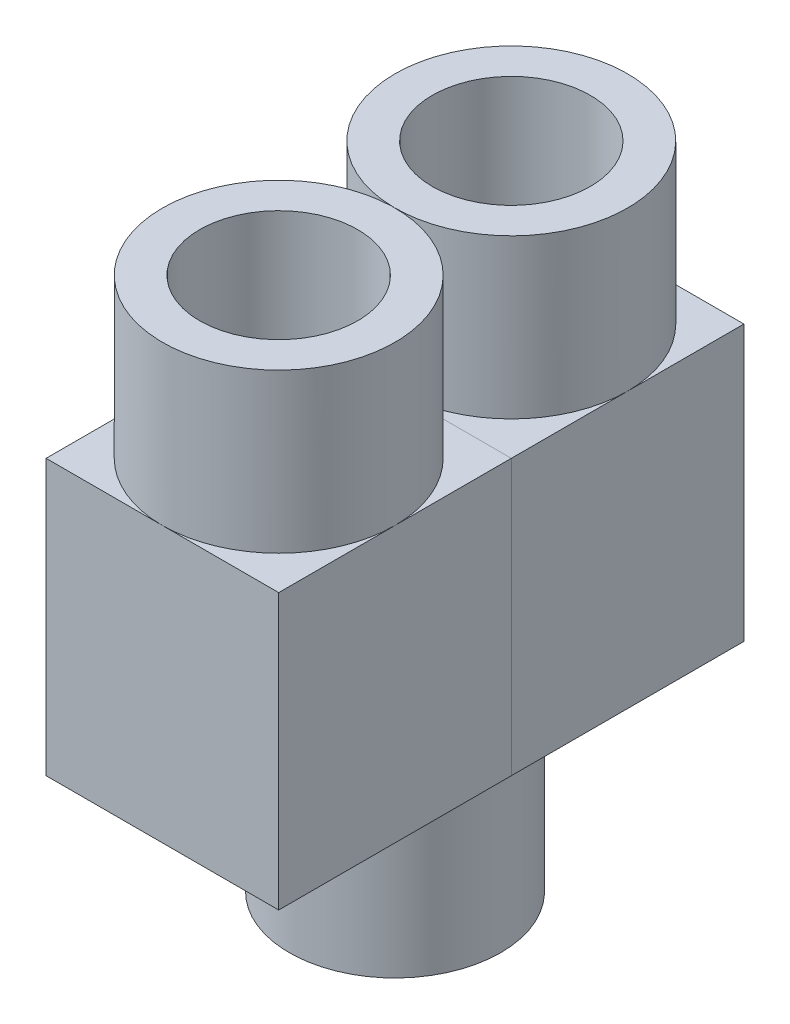
ISO-10303-21;
HEADER;
FILE_DESCRIPTION(('STEP AP214'),'2;1');
FILE_NAME('part.step','',(''),(''),'','','');
FILE_SCHEMA(('AUTOMOTIVE_DESIGN { 1 0 10303 214 1 1 1 1 }'));
ENDSEC;
DATA;
#1=APPLICATION_CONTEXT('core data for automotive mechanical design processes');
#2=APPLICATION_PROTOCOL_DEFINITION('international standard','automotive_design',2000,#1);
#3=PRODUCT_CONTEXT('',#1,'mechanical');
#4=PRODUCT('Part','Part','',(#3));
#5=PRODUCT_RELATED_PRODUCT_CATEGORY('part','',(#4));
#6=PRODUCT_DEFINITION_FORMATION('','',#4);
#7=PRODUCT_DEFINITION_CONTEXT('part definition',#1,'design');
#8=PRODUCT_DEFINITION('design','',#6,#7);
#9=PRODUCT_DEFINITION_SHAPE('','',#8);
#10=(LENGTH_UNIT() NAMED_UNIT(*) SI_UNIT(.MILLI.,.METRE.));
#11=(NAMED_UNIT(*) PLANE_ANGLE_UNIT() SI_UNIT($,.RADIAN.));
#12=(NAMED_UNIT(*) SI_UNIT($,.STERADIAN.) SOLID_ANGLE_UNIT());
#13=UNCERTAINTY_MEASURE_WITH_UNIT(LENGTH_MEASURE(1.E-05),#10,'distance_accuracy_value','');
#14=(GEOMETRIC_REPRESENTATION_CONTEXT(3) GLOBAL_UNCERTAINTY_ASSIGNED_CONTEXT((#13)) GLOBAL_UNIT_ASSIGNED_CONTEXT((#10,
#11,#12)) REPRESENTATION_CONTEXT('',''));
#15=CARTESIAN_POINT('',(0.,0.,0.));
#16=DIRECTION('',(0.,0.,1.));
#17=DIRECTION('',(1.,0.,0.));
#18=AXIS2_PLACEMENT_3D('',#15,#16,#17);
#19=CARTESIAN_POINT('',(0.,0.,11.));
#20=DIRECTION('',(0.,-1.,0.));
#21=DIRECTION('',(0.,0.,-1.));
#22=AXIS2_PLACEMENT_3D('',#19,#20,#21);
#23=PLANE('',#22);
#24=CARTESIAN_POINT('',(0.,0.,11.));
#25=DIRECTION('',(0.,-1.,0.));
#26=DIRECTION('',(1.,0.,0.));
#27=AXIS2_PLACEMENT_3D('',#24,#25,#26);
#28=CIRCLE('',#27,10.);
#29=CARTESIAN_POINT('',(10.,0.,11.));
#30=VERTEX_POINT('',#29);
#31=EDGE_CURVE('E12',#30,#30,#28,.T.);
#32=ORIENTED_EDGE('',*,*,#31,.T.);
#33=EDGE_LOOP('',(#32));
#34=FACE_BOUND('',#33,.T.);
#35=CARTESIAN_POINT('',(0.,0.,11.));
#36=DIRECTION('',(0.,-1.,0.));
#37=DIRECTION('',(0.,0.,-1.));
#38=AXIS2_PLACEMENT_3D('',#35,#36,#37);
#39=CIRCLE('',#38,8.);
#40=CARTESIAN_POINT('',(0.,0.,3.));
#41=VERTEX_POINT('',#40);
#42=EDGE_CURVE('E89',#41,#41,#39,.T.);
#43=ORIENTED_EDGE('',*,*,#42,.F.);
#44=EDGE_LOOP('',(#43));
#45=FACE_BOUND('',#44,.T.);
#46=ADVANCED_FACE('F78',(#34,#45),#23,.T.);
#47=CARTESIAN_POINT('',(0.,15.,11.));
#48=DIRECTION('',(0.,-1.,0.));
#49=DIRECTION('',(0.,0.,-1.));
#50=AXIS2_PLACEMENT_3D('',#47,#48,#49);
#51=PLANE('',#50);
#52=CARTESIAN_POINT('',(0.,15.,11.));
#53=DIRECTION('',(0.,-1.,0.));
#54=DIRECTION('',(1.,0.,0.));
#55=AXIS2_PLACEMENT_3D('',#52,#53,#54);
#56=CIRCLE('',#55,10.);
#57=CARTESIAN_POINT('',(10.,15.,11.));
#58=VERTEX_POINT('',#57);
#59=EDGE_CURVE('E82',#58,#58,#56,.T.);
#60=ORIENTED_EDGE('',*,*,#59,.F.);
#61=EDGE_LOOP('',(#60));
#62=FACE_BOUND('',#61,.T.);
#63=CARTESIAN_POINT('',(0.,15.,11.));
#64=DIRECTION('',(0.,-1.,0.));
#65=DIRECTION('',(0.,0.,-1.));
#66=AXIS2_PLACEMENT_3D('',#63,#64,#65);
#67=CIRCLE('',#66,8.);
#68=CARTESIAN_POINT('',(0.,15.,3.));
#69=VERTEX_POINT('',#68);
#70=EDGE_CURVE('E91',#69,#69,#67,.T.);
#71=ORIENTED_EDGE('',*,*,#70,.T.);
#72=EDGE_LOOP('',(#71));
#73=FACE_BOUND('',#72,.T.);
#74=ADVANCED_FACE('F101',(#62,#73),#51,.F.);
#75=CARTESIAN_POINT('',(0.,0.,11.));
#76=DIRECTION('',(0.,1.,0.));
#77=DIRECTION('',(0.,0.,1.));
#78=AXIS2_PLACEMENT_3D('',#75,#76,#77);
#79=CYLINDRICAL_SURFACE('',#78,10.);
#80=ORIENTED_EDGE('',*,*,#31,.F.);
#81=EDGE_LOOP('',(#80));
#82=FACE_BOUND('',#81,.T.);
#83=ORIENTED_EDGE('',*,*,#59,.T.);
#84=EDGE_LOOP('',(#83));
#85=FACE_BOUND('',#84,.T.);
#86=ADVANCED_FACE('F80',(#82,#85),#79,.T.);
#87=CARTESIAN_POINT('',(0.,0.,11.));
#88=DIRECTION('',(0.,1.,0.));
#89=DIRECTION('',(0.,0.,1.));
#90=AXIS2_PLACEMENT_3D('',#87,#88,#89);
#91=CYLINDRICAL_SURFACE('',#90,8.);
#92=ORIENTED_EDGE('',*,*,#42,.T.);
#93=EDGE_LOOP('',(#92));
#94=FACE_BOUND('',#93,.T.);
#95=ORIENTED_EDGE('',*,*,#70,.F.);
#96=EDGE_LOOP('',(#95));
#97=FACE_BOUND('',#96,.T.);
#98=ADVANCED_FACE('F97',(#94,#97),#91,.F.);
#99=CLOSED_SHELL('',(#46,#74,#86,#98));
#100=MANIFOLD_SOLID_BREP('B2',#99);
#101=CARTESIAN_POINT('',(-11.,41.,11.));
#102=DIRECTION('',(0.,1.,0.));
#103=DIRECTION('',(0.,0.,1.));
#104=AXIS2_PLACEMENT_3D('',#101,#102,#103);
#105=PLANE('',#104);
#106=DIRECTION('',(0.,0.,-1.));
#107=VECTOR('',#106,1.);
#108=CARTESIAN_POINT('',(11.,41.,33.));
#109=LINE('',#108,#107);
#110=CARTESIAN_POINT('',(11.,41.,33.));
#111=VERTEX_POINT('',#110);
#112=CARTESIAN_POINT('',(11.,41.,22.));
#113=VERTEX_POINT('',#112);
#114=EDGE_CURVE('E225',#111,#113,#109,.T.);
#115=ORIENTED_EDGE('',*,*,#114,.T.);
#116=CARTESIAN_POINT('',(0.,41.,22.));
#117=DIRECTION('',(0.,-1.,0.));
#118=DIRECTION('',(1.,0.,0.));
#119=AXIS2_PLACEMENT_3D('',#116,#117,#118);
#120=CIRCLE('',#119,11.);
#121=CARTESIAN_POINT('',(0.,41.,33.));
#122=VERTEX_POINT('',#121);
#123=EDGE_CURVE('E162',#113,#122,#120,.T.);
#124=ORIENTED_EDGE('',*,*,#123,.T.);
#125=DIRECTION('',(1.,0.,0.));
#126=VECTOR('',#125,1.);
#127=CARTESIAN_POINT('',(-11.,41.,33.));
#128=LINE('',#127,#126);
#129=EDGE_CURVE('E222',#122,#111,#128,.T.);
#130=ORIENTED_EDGE('',*,*,#129,.T.);
#131=EDGE_LOOP('',(#115,#124,#130));
#132=FACE_BOUND('',#131,.T.);
#133=ADVANCED_FACE('F150',(#132),#105,.T.);
#134=CARTESIAN_POINT('',(-11.,41.,33.));
#135=VERTEX_POINT('',#134);
#136=EDGE_CURVE('E234',#135,#122,#128,.T.);
#137=ORIENTED_EDGE('',*,*,#136,.T.);
#138=CARTESIAN_POINT('',(-11.,41.,22.));
#139=VERTEX_POINT('',#138);
#140=EDGE_CURVE('E76',#122,#139,#120,.T.);
#141=ORIENTED_EDGE('',*,*,#140,.T.);
#142=DIRECTION('',(0.,0.,1.));
#143=VECTOR('',#142,1.);
#144=CARTESIAN_POINT('',(-11.,41.,11.));
#145=LINE('',#144,#143);
#146=EDGE_CURVE('E239',#139,#135,#145,.T.);
#147=ORIENTED_EDGE('',*,*,#146,.T.);
#148=EDGE_LOOP('',(#137,#141,#147));
#149=FACE_BOUND('',#148,.T.);
#150=ADVANCED_FACE('F238',(#149),#105,.T.);
#151=CARTESIAN_POINT('',(-11.,41.,11.));
#152=VERTEX_POINT('',#151);
#153=EDGE_CURVE('E236',#152,#139,#145,.T.);
#154=ORIENTED_EDGE('',*,*,#153,.T.);
#155=CARTESIAN_POINT('',(0.,41.,11.));
#156=VERTEX_POINT('',#155);
#157=EDGE_CURVE('E160',#139,#156,#120,.T.);
#158=ORIENTED_EDGE('',*,*,#157,.T.);
#159=DIRECTION('',(-1.,0.,0.));
#160=VECTOR('',#159,1.);
#161=CARTESIAN_POINT('',(11.,41.,11.));
#162=LINE('',#161,#160);
#163=EDGE_CURVE('E206',#156,#152,#162,.T.);
#164=ORIENTED_EDGE('',*,*,#163,.T.);
#165=EDGE_LOOP('',(#154,#158,#164));
#166=FACE_BOUND('',#165,.T.);
#167=ADVANCED_FACE('F298',(#166),#105,.T.);
#168=CARTESIAN_POINT('',(11.,41.,11.));
#169=VERTEX_POINT('',#168);
#170=EDGE_CURVE('E244',#169,#156,#162,.T.);
#171=ORIENTED_EDGE('',*,*,#170,.T.);
#172=EDGE_CURVE('E229',#156,#113,#120,.T.);
#173=ORIENTED_EDGE('',*,*,#172,.T.);
#174=EDGE_CURVE('E176',#113,#169,#109,.T.);
#175=ORIENTED_EDGE('',*,*,#174,.T.);
#176=EDGE_LOOP('',(#171,#173,#175));
#177=FACE_BOUND('',#176,.T.);
#178=ADVANCED_FACE('F293',(#177),#105,.T.);
#179=CARTESIAN_POINT('',(-11.,15.,11.));
#180=DIRECTION('',(0.,1.,0.));
#181=DIRECTION('',(0.,0.,1.));
#182=AXIS2_PLACEMENT_3D('',#179,#180,#181);
#183=PLANE('',#182);
#184=DIRECTION('',(0.,0.,-1.));
#185=VECTOR('',#184,1.);
#186=CARTESIAN_POINT('',(11.,15.,22.));
#187=LINE('',#186,#185);
#188=CARTESIAN_POINT('',(11.,15.,33.));
#189=VERTEX_POINT('',#188);
#190=CARTESIAN_POINT('',(11.,15.,11.));
#191=VERTEX_POINT('',#190);
#192=EDGE_CURVE('E198',#189,#191,#187,.T.);
#193=ORIENTED_EDGE('',*,*,#192,.F.);
#194=DIRECTION('',(1.,0.,0.));
#195=VECTOR('',#194,1.);
#196=CARTESIAN_POINT('',(0.,15.,33.));
#197=LINE('',#196,#195);
#198=CARTESIAN_POINT('',(-11.,15.,33.));
#199=VERTEX_POINT('',#198);
#200=EDGE_CURVE('E250',#199,#189,#197,.T.);
#201=ORIENTED_EDGE('',*,*,#200,.F.);
#202=DIRECTION('',(0.,0.,1.));
#203=VECTOR('',#202,1.);
#204=CARTESIAN_POINT('',(-11.,15.,22.));
#205=LINE('',#204,#203);
#206=CARTESIAN_POINT('',(-11.,15.,11.));
#207=VERTEX_POINT('',#206);
#208=EDGE_CURVE('E247',#207,#199,#205,.T.);
#209=ORIENTED_EDGE('',*,*,#208,.F.);
#210=DIRECTION('',(-1.,0.,0.));
#211=VECTOR('',#210,1.);
#212=CARTESIAN_POINT('',(11.,15.,11.));
#213=LINE('',#212,#211);
#214=EDGE_CURVE('E255',#191,#207,#213,.T.);
#215=ORIENTED_EDGE('',*,*,#214,.F.);
#216=EDGE_LOOP('',(#193,#201,#209,#215));
#217=FACE_BOUND('',#216,.T.);
#218=ADVANCED_FACE('F302',(#217),#183,.F.);
#219=CARTESIAN_POINT('',(-11.,41.,22.));
#220=DIRECTION('',(1.,0.,0.));
#221=DIRECTION('',(0.,0.,-1.));
#222=AXIS2_PLACEMENT_3D('',#219,#220,#221);
#223=PLANE('',#222);
#224=ORIENTED_EDGE('',*,*,#208,.T.);
#225=DIRECTION('',(0.,-1.,0.));
#226=VECTOR('',#225,1.);
#227=CARTESIAN_POINT('',(-11.,41.,33.));
#228=LINE('',#227,#226);
#229=EDGE_CURVE('E259',#135,#199,#228,.T.);
#230=ORIENTED_EDGE('',*,*,#229,.F.);
#231=ORIENTED_EDGE('',*,*,#146,.F.);
#232=ORIENTED_EDGE('',*,*,#153,.F.);
#233=DIRECTION('',(0.,-1.,0.));
#234=VECTOR('',#233,1.);
#235=CARTESIAN_POINT('',(-11.,41.,11.));
#236=LINE('',#235,#234);
#237=EDGE_CURVE('E154',#152,#207,#236,.T.);
#238=ORIENTED_EDGE('',*,*,#237,.T.);
#239=EDGE_LOOP('',(#224,#230,#231,#232,#238));
#240=FACE_BOUND('',#239,.T.);
#241=ADVANCED_FACE('F152',(#240),#223,.F.);
#242=CARTESIAN_POINT('',(0.,41.,33.));
#243=DIRECTION('',(0.,0.,-1.));
#244=DIRECTION('',(-1.,0.,0.));
#245=AXIS2_PLACEMENT_3D('',#242,#243,#244);
#246=PLANE('',#245);
#247=ORIENTED_EDGE('',*,*,#200,.T.);
#248=DIRECTION('',(0.,-1.,0.));
#249=VECTOR('',#248,1.);
#250=CARTESIAN_POINT('',(11.,41.,33.));
#251=LINE('',#250,#249);
#252=EDGE_CURVE('E235',#111,#189,#251,.T.);
#253=ORIENTED_EDGE('',*,*,#252,.F.);
#254=ORIENTED_EDGE('',*,*,#129,.F.);
#255=ORIENTED_EDGE('',*,*,#136,.F.);
#256=ORIENTED_EDGE('',*,*,#229,.T.);
#257=EDGE_LOOP('',(#247,#253,#254,#255,#256));
#258=FACE_BOUND('',#257,.T.);
#259=ADVANCED_FACE('F232',(#258),#246,.F.);
#260=CARTESIAN_POINT('',(11.,41.,22.));
#261=DIRECTION('',(-1.,0.,0.));
#262=DIRECTION('',(0.,0.,1.));
#263=AXIS2_PLACEMENT_3D('',#260,#261,#262);
#264=PLANE('',#263);
#265=ORIENTED_EDGE('',*,*,#192,.T.);
#266=DIRECTION('',(0.,-1.,0.));
#267=VECTOR('',#266,1.);
#268=CARTESIAN_POINT('',(11.,41.,11.));
#269=LINE('',#268,#267);
#270=EDGE_CURVE('E246',#169,#191,#269,.T.);
#271=ORIENTED_EDGE('',*,*,#270,.F.);
#272=ORIENTED_EDGE('',*,*,#174,.F.);
#273=ORIENTED_EDGE('',*,*,#114,.F.);
#274=ORIENTED_EDGE('',*,*,#252,.T.);
#275=EDGE_LOOP('',(#265,#271,#272,#273,#274));
#276=FACE_BOUND('',#275,.T.);
#277=ADVANCED_FACE('F319',(#276),#264,.F.);
#278=CARTESIAN_POINT('',(11.,41.,11.));
#279=DIRECTION('',(0.,0.,1.));
#280=DIRECTION('',(1.,0.,0.));
#281=AXIS2_PLACEMENT_3D('',#278,#279,#280);
#282=PLANE('',#281);
#283=ORIENTED_EDGE('',*,*,#214,.T.);
#284=ORIENTED_EDGE('',*,*,#237,.F.);
#285=ORIENTED_EDGE('',*,*,#163,.F.);
#286=ORIENTED_EDGE('',*,*,#170,.F.);
#287=ORIENTED_EDGE('',*,*,#270,.T.);
#288=EDGE_LOOP('',(#283,#284,#285,#286,#287));
#289=FACE_BOUND('',#288,.T.);
#290=ADVANCED_FACE('F311',(#289),#282,.F.);
#291=CARTESIAN_POINT('',(0.,56.,22.));
#292=DIRECTION('',(0.,-1.,0.));
#293=DIRECTION('',(0.,0.,-1.));
#294=AXIS2_PLACEMENT_3D('',#291,#292,#293);
#295=CYLINDRICAL_SURFACE('',#294,11.);
#296=CARTESIAN_POINT('',(0.,56.,22.));
#297=DIRECTION('',(0.,-1.,0.));
#298=DIRECTION('',(-1.,0.,0.));
#299=AXIS2_PLACEMENT_3D('',#296,#297,#298);
#300=CIRCLE('',#299,11.);
#301=CARTESIAN_POINT('',(-11.,56.,22.));
#302=VERTEX_POINT('',#301);
#303=EDGE_CURVE('E227',#302,#302,#300,.T.);
#304=ORIENTED_EDGE('',*,*,#303,.T.);
#305=EDGE_LOOP('',(#304));
#306=FACE_BOUND('',#305,.T.);
#307=ORIENTED_EDGE('',*,*,#123,.F.);
#308=ORIENTED_EDGE('',*,*,#172,.F.);
#309=ORIENTED_EDGE('',*,*,#157,.F.);
#310=ORIENTED_EDGE('',*,*,#140,.F.);
#311=EDGE_LOOP('',(#307,#308,#309,#310));
#312=FACE_BOUND('',#311,.T.);
#313=ADVANCED_FACE('F215',(#306,#312),#295,.T.);
#314=CARTESIAN_POINT('',(0.,56.,22.));
#315=DIRECTION('',(0.,-1.,0.));
#316=DIRECTION('',(0.,0.,-1.));
#317=AXIS2_PLACEMENT_3D('',#314,#315,#316);
#318=PLANE('',#317);
#319=CARTESIAN_POINT('',(0.,56.,22.));
#320=DIRECTION('',(0.,-1.,0.));
#321=DIRECTION('',(0.,0.,1.));
#322=AXIS2_PLACEMENT_3D('',#319,#320,#321);
#323=CIRCLE('',#322,7.475);
#324=CARTESIAN_POINT('',(0.,56.,29.475));
#325=VERTEX_POINT('',#324);
#326=EDGE_CURVE('E272',#325,#325,#323,.T.);
#327=ORIENTED_EDGE('',*,*,#326,.T.);
#328=EDGE_LOOP('',(#327));
#329=FACE_BOUND('',#328,.T.);
#330=ORIENTED_EDGE('',*,*,#303,.F.);
#331=EDGE_LOOP('',(#330));
#332=FACE_BOUND('',#331,.T.);
#333=ADVANCED_FACE('F276',(#329,#332),#318,.F.);
#334=CARTESIAN_POINT('',(0.,41.,22.));
#335=DIRECTION('',(0.,-1.,0.));
#336=DIRECTION('',(0.,0.,-1.));
#337=AXIS2_PLACEMENT_3D('',#334,#335,#336);
#338=PLANE('',#337);
#339=CARTESIAN_POINT('',(0.,41.,22.));
#340=DIRECTION('',(0.,1.,0.));
#341=DIRECTION('',(0.,0.,1.));
#342=AXIS2_PLACEMENT_3D('',#339,#340,#341);
#343=CIRCLE('',#342,7.475);
#344=CARTESIAN_POINT('',(0.,41.,29.475));
#345=VERTEX_POINT('',#344);
#346=EDGE_CURVE('E228',#345,#345,#343,.T.);
#347=ORIENTED_EDGE('',*,*,#346,.T.);
#348=EDGE_LOOP('',(#347));
#349=FACE_BOUND('',#348,.T.);
#350=ADVANCED_FACE('F281',(#349),#338,.F.);
#351=CARTESIAN_POINT('',(0.,56.,22.));
#352=DIRECTION('',(0.,-1.,0.));
#353=DIRECTION('',(0.,0.,1.));
#354=AXIS2_PLACEMENT_3D('',#351,#352,#353);
#355=CYLINDRICAL_SURFACE('',#354,7.475);
#356=ORIENTED_EDGE('',*,*,#346,.F.);
#357=EDGE_LOOP('',(#356));
#358=FACE_BOUND('',#357,.T.);
#359=ORIENTED_EDGE('',*,*,#326,.F.);
#360=EDGE_LOOP('',(#359));
#361=FACE_BOUND('',#360,.T.);
#362=ADVANCED_FACE('F279',(#358,#361),#355,.F.);
#363=CLOSED_SHELL('',(#133,#150,#167,#178,#218,#241,#259,#277,#290,#313,#333,#350,#362));
#364=MANIFOLD_SOLID_BREP('B7',#363);
#365=CARTESIAN_POINT('',(-11.,41.,-11.));
#366=DIRECTION('',(0.,1.,0.));
#367=DIRECTION('',(0.,0.,1.));
#368=AXIS2_PLACEMENT_3D('',#365,#366,#367);
#369=PLANE('',#368);
#370=DIRECTION('',(0.,0.,-1.));
#371=VECTOR('',#370,1.);
#372=CARTESIAN_POINT('',(11.,41.,11.));
#373=LINE('',#372,#371);
#374=CARTESIAN_POINT('',(11.,41.,11.));
#375=VERTEX_POINT('',#374);
#376=CARTESIAN_POINT('',(11.,41.,0.));
#377=VERTEX_POINT('',#376);
#378=EDGE_CURVE('E646',#375,#377,#373,.T.);
#379=ORIENTED_EDGE('',*,*,#378,.T.);
#380=CARTESIAN_POINT('',(0.,41.,0.));
#381=DIRECTION('',(0.,-1.,0.));
#382=DIRECTION('',(1.,0.,0.));
#383=AXIS2_PLACEMENT_3D('',#380,#381,#382);
#384=CIRCLE('',#383,11.);
#385=CARTESIAN_POINT('',(0.,41.,11.));
#386=VERTEX_POINT('',#385);
#387=EDGE_CURVE('E583',#377,#386,#384,.T.);
#388=ORIENTED_EDGE('',*,*,#387,.T.);
#389=DIRECTION('',(1.,0.,0.));
#390=VECTOR('',#389,1.);
#391=CARTESIAN_POINT('',(-11.,41.,11.));
#392=LINE('',#391,#390);
#393=EDGE_CURVE('E643',#386,#375,#392,.T.);
#394=ORIENTED_EDGE('',*,*,#393,.T.);
#395=EDGE_LOOP('',(#379,#388,#394));
#396=FACE_BOUND('',#395,.T.);
#397=ADVANCED_FACE('F571',(#396),#369,.T.);
#398=CARTESIAN_POINT('',(-11.,41.,11.));
#399=VERTEX_POINT('',#398);
#400=EDGE_CURVE('E655',#399,#386,#392,.T.);
#401=ORIENTED_EDGE('',*,*,#400,.T.);
#402=CARTESIAN_POINT('',(-11.,41.,0.));
#403=VERTEX_POINT('',#402);
#404=EDGE_CURVE('E148',#386,#403,#384,.T.);
#405=ORIENTED_EDGE('',*,*,#404,.T.);
#406=DIRECTION('',(0.,0.,1.));
#407=VECTOR('',#406,1.);
#408=CARTESIAN_POINT('',(-11.,41.,-11.));
#409=LINE('',#408,#407);
#410=EDGE_CURVE('E660',#403,#399,#409,.T.);
#411=ORIENTED_EDGE('',*,*,#410,.T.);
#412=EDGE_LOOP('',(#401,#405,#411));
#413=FACE_BOUND('',#412,.T.);
#414=ADVANCED_FACE('F659',(#413),#369,.T.);
#415=CARTESIAN_POINT('',(-11.,41.,-11.));
#416=VERTEX_POINT('',#415);
#417=EDGE_CURVE('E657',#416,#403,#409,.T.);
#418=ORIENTED_EDGE('',*,*,#417,.T.);
#419=CARTESIAN_POINT('',(0.,41.,-11.));
#420=VERTEX_POINT('',#419);
#421=EDGE_CURVE('E581',#403,#420,#384,.T.);
#422=ORIENTED_EDGE('',*,*,#421,.T.);
#423=DIRECTION('',(-1.,0.,0.));
#424=VECTOR('',#423,1.);
#425=CARTESIAN_POINT('',(11.,41.,-11.));
#426=LINE('',#425,#424);
#427=EDGE_CURVE('E627',#420,#416,#426,.T.);
#428=ORIENTED_EDGE('',*,*,#427,.T.);
#429=EDGE_LOOP('',(#418,#422,#428));
#430=FACE_BOUND('',#429,.T.);
#431=ADVANCED_FACE('F718',(#430),#369,.T.);
#432=CARTESIAN_POINT('',(11.,41.,-11.));
#433=VERTEX_POINT('',#432);
#434=EDGE_CURVE('E665',#433,#420,#426,.T.);
#435=ORIENTED_EDGE('',*,*,#434,.T.);
#436=EDGE_CURVE('E650',#420,#377,#384,.T.);
#437=ORIENTED_EDGE('',*,*,#436,.T.);
#438=EDGE_CURVE('E597',#377,#433,#373,.T.);
#439=ORIENTED_EDGE('',*,*,#438,.T.);
#440=EDGE_LOOP('',(#435,#437,#439));
#441=FACE_BOUND('',#440,.T.);
#442=ADVANCED_FACE('F714',(#441),#369,.T.);
#443=CARTESIAN_POINT('',(-11.,15.,-11.));
#444=DIRECTION('',(0.,1.,0.));
#445=DIRECTION('',(0.,0.,1.));
#446=AXIS2_PLACEMENT_3D('',#443,#444,#445);
#447=PLANE('',#446);
#448=DIRECTION('',(0.,0.,-1.));
#449=VECTOR('',#448,1.);
#450=CARTESIAN_POINT('',(11.,15.,0.));
#451=LINE('',#450,#449);
#452=CARTESIAN_POINT('',(11.,15.,11.));
#453=VERTEX_POINT('',#452);
#454=CARTESIAN_POINT('',(11.,15.,-11.));
#455=VERTEX_POINT('',#454);
#456=EDGE_CURVE('E619',#453,#455,#451,.T.);
#457=ORIENTED_EDGE('',*,*,#456,.F.);
#458=DIRECTION('',(1.,0.,0.));
#459=VECTOR('',#458,1.);
#460=CARTESIAN_POINT('',(0.,15.,11.));
#461=LINE('',#460,#459);
#462=CARTESIAN_POINT('',(-11.,15.,11.));
#463=VERTEX_POINT('',#462);
#464=EDGE_CURVE('E671',#463,#453,#461,.T.);
#465=ORIENTED_EDGE('',*,*,#464,.F.);
#466=DIRECTION('',(0.,0.,1.));
#467=VECTOR('',#466,1.);
#468=CARTESIAN_POINT('',(-11.,15.,0.));
#469=LINE('',#468,#467);
#470=CARTESIAN_POINT('',(-11.,15.,-11.));
#471=VERTEX_POINT('',#470);
#472=EDGE_CURVE('E668',#471,#463,#469,.T.);
#473=ORIENTED_EDGE('',*,*,#472,.F.);
#474=DIRECTION('',(-1.,0.,0.));
#475=VECTOR('',#474,1.);
#476=CARTESIAN_POINT('',(11.,15.,-11.));
#477=LINE('',#476,#475);
#478=EDGE_CURVE('E676',#455,#471,#477,.T.);
#479=ORIENTED_EDGE('',*,*,#478,.F.);
#480=EDGE_LOOP('',(#457,#465,#473,#479));
#481=FACE_BOUND('',#480,.T.);
#482=ADVANCED_FACE('F722',(#481),#447,.F.);
#483=CARTESIAN_POINT('',(-11.,41.,0.));
#484=DIRECTION('',(1.,0.,0.));
#485=DIRECTION('',(0.,0.,-1.));
#486=AXIS2_PLACEMENT_3D('',#483,#484,#485);
#487=PLANE('',#486);
#488=ORIENTED_EDGE('',*,*,#472,.T.);
#489=DIRECTION('',(0.,-1.,0.));
#490=VECTOR('',#489,1.);
#491=CARTESIAN_POINT('',(-11.,41.,11.));
#492=LINE('',#491,#490);
#493=EDGE_CURVE('E680',#399,#463,#492,.T.);
#494=ORIENTED_EDGE('',*,*,#493,.F.);
#495=ORIENTED_EDGE('',*,*,#410,.F.);
#496=ORIENTED_EDGE('',*,*,#417,.F.);
#497=DIRECTION('',(0.,-1.,0.));
#498=VECTOR('',#497,1.);
#499=CARTESIAN_POINT('',(-11.,41.,-11.));
#500=LINE('',#499,#498);
#501=EDGE_CURVE('E575',#416,#471,#500,.T.);
#502=ORIENTED_EDGE('',*,*,#501,.T.);
#503=EDGE_LOOP('',(#488,#494,#495,#496,#502));
#504=FACE_BOUND('',#503,.T.);
#505=ADVANCED_FACE('F573',(#504),#487,.F.);
#506=CARTESIAN_POINT('',(0.,41.,11.));
#507=DIRECTION('',(0.,0.,-1.));
#508=DIRECTION('',(-1.,0.,0.));
#509=AXIS2_PLACEMENT_3D('',#506,#507,#508);
#510=PLANE('',#509);
#511=ORIENTED_EDGE('',*,*,#464,.T.);
#512=DIRECTION('',(0.,-1.,0.));
#513=VECTOR('',#512,1.);
#514=CARTESIAN_POINT('',(11.,41.,11.));
#515=LINE('',#514,#513);
#516=EDGE_CURVE('E656',#375,#453,#515,.T.);
#517=ORIENTED_EDGE('',*,*,#516,.F.);
#518=ORIENTED_EDGE('',*,*,#393,.F.);
#519=ORIENTED_EDGE('',*,*,#400,.F.);
#520=ORIENTED_EDGE('',*,*,#493,.T.);
#521=EDGE_LOOP('',(#511,#517,#518,#519,#520));
#522=FACE_BOUND('',#521,.T.);
#523=ADVANCED_FACE('F653',(#522),#510,.F.);
#524=CARTESIAN_POINT('',(11.,41.,0.));
#525=DIRECTION('',(-1.,0.,0.));
#526=DIRECTION('',(0.,0.,1.));
#527=AXIS2_PLACEMENT_3D('',#524,#525,#526);
#528=PLANE('',#527);
#529=ORIENTED_EDGE('',*,*,#456,.T.);
#530=DIRECTION('',(0.,-1.,0.));
#531=VECTOR('',#530,1.);
#532=CARTESIAN_POINT('',(11.,41.,-11.));
#533=LINE('',#532,#531);
#534=EDGE_CURVE('E667',#433,#455,#533,.T.);
#535=ORIENTED_EDGE('',*,*,#534,.F.);
#536=ORIENTED_EDGE('',*,*,#438,.F.);
#537=ORIENTED_EDGE('',*,*,#378,.F.);
#538=ORIENTED_EDGE('',*,*,#516,.T.);
#539=EDGE_LOOP('',(#529,#535,#536,#537,#538));
#540=FACE_BOUND('',#539,.T.);
#541=ADVANCED_FACE('F739',(#540),#528,.F.);
#542=CARTESIAN_POINT('',(11.,41.,-11.));
#543=DIRECTION('',(0.,0.,1.));
#544=DIRECTION('',(1.,0.,0.));
#545=AXIS2_PLACEMENT_3D('',#542,#543,#544);
#546=PLANE('',#545);
#547=ORIENTED_EDGE('',*,*,#478,.T.);
#548=ORIENTED_EDGE('',*,*,#501,.F.);
#549=ORIENTED_EDGE('',*,*,#427,.F.);
#550=ORIENTED_EDGE('',*,*,#434,.F.);
#551=ORIENTED_EDGE('',*,*,#534,.T.);
#552=EDGE_LOOP('',(#547,#548,#549,#550,#551));
#553=FACE_BOUND('',#552,.T.);
#554=ADVANCED_FACE('F730',(#553),#546,.F.);
#555=CARTESIAN_POINT('',(0.,56.,0.));
#556=DIRECTION('',(0.,-1.,0.));
#557=DIRECTION('',(0.,0.,-1.));
#558=AXIS2_PLACEMENT_3D('',#555,#556,#557);
#559=CYLINDRICAL_SURFACE('',#558,11.);
#560=CARTESIAN_POINT('',(0.,56.,0.));
#561=DIRECTION('',(0.,-1.,0.));
#562=DIRECTION('',(-1.,0.,0.));
#563=AXIS2_PLACEMENT_3D('',#560,#561,#562);
#564=CIRCLE('',#563,11.);
#565=CARTESIAN_POINT('',(-11.,56.,0.));
#566=VERTEX_POINT('',#565);
#567=EDGE_CURVE('E648',#566,#566,#564,.T.);
#568=ORIENTED_EDGE('',*,*,#567,.T.);
#569=EDGE_LOOP('',(#568));
#570=FACE_BOUND('',#569,.T.);
#571=ORIENTED_EDGE('',*,*,#387,.F.);
#572=ORIENTED_EDGE('',*,*,#436,.F.);
#573=ORIENTED_EDGE('',*,*,#421,.F.);
#574=ORIENTED_EDGE('',*,*,#404,.F.);
#575=EDGE_LOOP('',(#571,#572,#573,#574));
#576=FACE_BOUND('',#575,.T.);
#577=ADVANCED_FACE('F636',(#570,#576),#559,.T.);
#578=CARTESIAN_POINT('',(0.,56.,0.));
#579=DIRECTION('',(0.,-1.,0.));
#580=DIRECTION('',(0.,0.,-1.));
#581=AXIS2_PLACEMENT_3D('',#578,#579,#580);
#582=PLANE('',#581);
#583=CARTESIAN_POINT('',(0.,56.,0.));
#584=DIRECTION('',(0.,-1.,0.));
#585=DIRECTION('',(0.,0.,1.));
#586=AXIS2_PLACEMENT_3D('',#583,#584,#585);
#587=CIRCLE('',#586,7.475);
#588=CARTESIAN_POINT('',(0.,56.,7.475));
#589=VERTEX_POINT('',#588);
#590=EDGE_CURVE('E693',#589,#589,#587,.T.);
#591=ORIENTED_EDGE('',*,*,#590,.T.);
#592=EDGE_LOOP('',(#591));
#593=FACE_BOUND('',#592,.T.);
#594=ORIENTED_EDGE('',*,*,#567,.F.);
#595=EDGE_LOOP('',(#594));
#596=FACE_BOUND('',#595,.T.);
#597=ADVANCED_FACE('F697',(#593,#596),#582,.F.);
#598=CARTESIAN_POINT('',(0.,41.,0.));
#599=DIRECTION('',(0.,-1.,0.));
#600=DIRECTION('',(0.,0.,-1.));
#601=AXIS2_PLACEMENT_3D('',#598,#599,#600);
#602=PLANE('',#601);
#603=CARTESIAN_POINT('',(0.,41.,0.));
#604=DIRECTION('',(0.,1.,0.));
#605=DIRECTION('',(0.,0.,1.));
#606=AXIS2_PLACEMENT_3D('',#603,#604,#605);
#607=CIRCLE('',#606,7.475);
#608=CARTESIAN_POINT('',(0.,41.,7.475));
#609=VERTEX_POINT('',#608);
#610=EDGE_CURVE('E649',#609,#609,#607,.T.);
#611=ORIENTED_EDGE('',*,*,#610,.T.);
#612=EDGE_LOOP('',(#611));
#613=FACE_BOUND('',#612,.T.);
#614=ADVANCED_FACE('F702',(#613),#602,.F.);
#615=CARTESIAN_POINT('',(0.,56.,0.));
#616=DIRECTION('',(0.,-1.,0.));
#617=DIRECTION('',(0.,0.,1.));
#618=AXIS2_PLACEMENT_3D('',#615,#616,#617);
#619=CYLINDRICAL_SURFACE('',#618,7.475);
#620=ORIENTED_EDGE('',*,*,#610,.F.);
#621=EDGE_LOOP('',(#620));
#622=FACE_BOUND('',#621,.T.);
#623=ORIENTED_EDGE('',*,*,#590,.F.);
#624=EDGE_LOOP('',(#623));
#625=FACE_BOUND('',#624,.T.);
#626=ADVANCED_FACE('F700',(#622,#625),#619,.F.);
#627=CLOSED_SHELL('',(#397,#414,#431,#442,#482,#505,#523,#541,#554,#577,#597,#614,#626));
#628=MANIFOLD_SOLID_BREP('B70',#627);
#629=ADVANCED_BREP_SHAPE_REPRESENTATION('',(#18,#100,#364,#628),#14);
#630=SHAPE_DEFINITION_REPRESENTATION(#9,#629);
ENDSEC;
END-ISO-10303-21;
